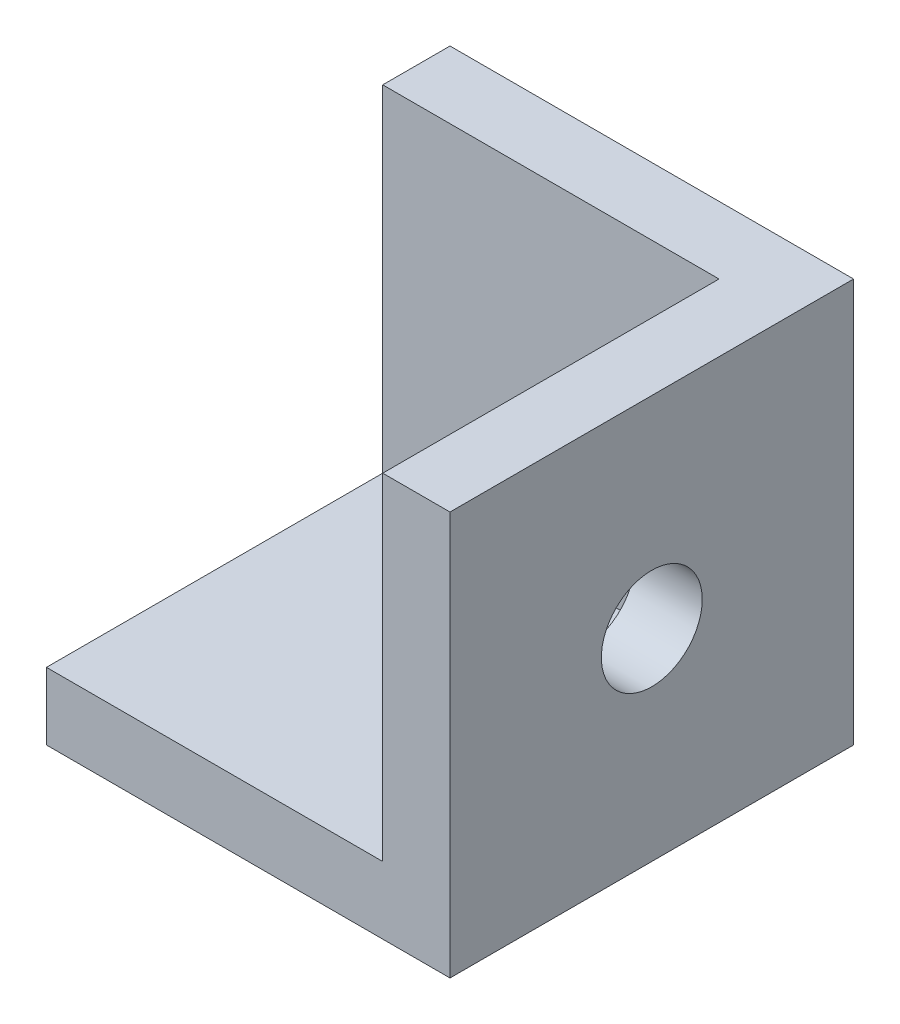
ISO-10303-21;
HEADER;
FILE_DESCRIPTION(('STEP AP214'),'2;1');
FILE_NAME('part.step','',(''),(''),'','','');
FILE_SCHEMA(('AUTOMOTIVE_DESIGN { 1 0 10303 214 1 1 1 1 }'));
ENDSEC;
DATA;
#1=APPLICATION_CONTEXT('core data for automotive mechanical design processes');
#2=APPLICATION_PROTOCOL_DEFINITION('international standard','automotive_design',2000,#1);
#3=PRODUCT_CONTEXT('',#1,'mechanical');
#4=PRODUCT('Part','Part','',(#3));
#5=PRODUCT_RELATED_PRODUCT_CATEGORY('part','',(#4));
#6=PRODUCT_DEFINITION_FORMATION('','',#4);
#7=PRODUCT_DEFINITION_CONTEXT('part definition',#1,'design');
#8=PRODUCT_DEFINITION('design','',#6,#7);
#9=PRODUCT_DEFINITION_SHAPE('','',#8);
#10=(LENGTH_UNIT() NAMED_UNIT(*) SI_UNIT(.MILLI.,.METRE.));
#11=(NAMED_UNIT(*) PLANE_ANGLE_UNIT() SI_UNIT($,.RADIAN.));
#12=(NAMED_UNIT(*) SI_UNIT($,.STERADIAN.) SOLID_ANGLE_UNIT());
#13=UNCERTAINTY_MEASURE_WITH_UNIT(LENGTH_MEASURE(1.E-05),#10,'distance_accuracy_value','');
#14=(GEOMETRIC_REPRESENTATION_CONTEXT(3) GLOBAL_UNCERTAINTY_ASSIGNED_CONTEXT((#13)) GLOBAL_UNIT_ASSIGNED_CONTEXT((#10,
#11,#12)) REPRESENTATION_CONTEXT('',''));
#15=CARTESIAN_POINT('',(0.,0.,0.));
#16=DIRECTION('',(0.,0.,1.));
#17=DIRECTION('',(1.,0.,0.));
#18=AXIS2_PLACEMENT_3D('',#15,#16,#17);
#19=CARTESIAN_POINT('',(19.05,3.175,3.175));
#20=DIRECTION('',(0.,0.,-1.));
#21=DIRECTION('',(-1.,0.,0.));
#22=AXIS2_PLACEMENT_3D('',#19,#20,#21);
#23=PLANE('',#22);
#24=DIRECTION('',(0.,-1.,0.));
#25=VECTOR('',#24,1.);
#26=CARTESIAN_POINT('',(15.875,3.175,3.175));
#27=LINE('',#26,#25);
#28=CARTESIAN_POINT('',(15.875,19.05,3.175));
#29=VERTEX_POINT('',#28);
#30=CARTESIAN_POINT('',(15.875,3.175,3.175));
#31=VERTEX_POINT('',#30);
#32=EDGE_CURVE('E127',#29,#31,#27,.T.);
#33=ORIENTED_EDGE('',*,*,#32,.F.);
#34=DIRECTION('',(-1.,0.,0.));
#35=VECTOR('',#34,1.);
#36=CARTESIAN_POINT('',(19.05,19.05,3.175));
#37=LINE('',#36,#35);
#38=CARTESIAN_POINT('',(0.,19.05,3.175));
#39=VERTEX_POINT('',#38);
#40=EDGE_CURVE('E112',#29,#39,#37,.T.);
#41=ORIENTED_EDGE('',*,*,#40,.T.);
#42=DIRECTION('',(0.,-1.,0.));
#43=VECTOR('',#42,1.);
#44=CARTESIAN_POINT('',(0.,3.175,3.175));
#45=LINE('',#44,#43);
#46=CARTESIAN_POINT('',(0.,3.175,3.175));
#47=VERTEX_POINT('',#46);
#48=EDGE_CURVE('E143',#39,#47,#45,.T.);
#49=ORIENTED_EDGE('',*,*,#48,.T.);
#50=DIRECTION('',(-1.,0.,0.));
#51=VECTOR('',#50,1.);
#52=CARTESIAN_POINT('',(19.05,3.175,3.175));
#53=LINE('',#52,#51);
#54=EDGE_CURVE('E151',#31,#47,#53,.T.);
#55=ORIENTED_EDGE('',*,*,#54,.F.);
#56=EDGE_LOOP('',(#33,#41,#49,#55));
#57=FACE_BOUND('',#56,.T.);
#58=ADVANCED_FACE('F37',(#57),#23,.F.);
#59=CARTESIAN_POINT('',(19.05,3.175,3.175));
#60=DIRECTION('',(0.,-1.,0.));
#61=DIRECTION('',(0.,0.,-1.));
#62=AXIS2_PLACEMENT_3D('',#59,#60,#61);
#63=PLANE('',#62);
#64=DIRECTION('',(0.,0.,1.));
#65=VECTOR('',#64,1.);
#66=CARTESIAN_POINT('',(15.875,3.175,3.175));
#67=LINE('',#66,#65);
#68=CARTESIAN_POINT('',(15.875,3.175,19.05));
#69=VERTEX_POINT('',#68);
#70=EDGE_CURVE('E119',#31,#69,#67,.T.);
#71=ORIENTED_EDGE('',*,*,#70,.F.);
#72=ORIENTED_EDGE('',*,*,#54,.T.);
#73=DIRECTION('',(0.,0.,1.));
#74=VECTOR('',#73,1.);
#75=CARTESIAN_POINT('',(0.,3.175,3.175));
#76=LINE('',#75,#74);
#77=CARTESIAN_POINT('',(0.,3.175,19.05));
#78=VERTEX_POINT('',#77);
#79=EDGE_CURVE('E146',#47,#78,#76,.T.);
#80=ORIENTED_EDGE('',*,*,#79,.T.);
#81=DIRECTION('',(-1.,0.,0.));
#82=VECTOR('',#81,1.);
#83=CARTESIAN_POINT('',(19.05,3.175,19.05));
#84=LINE('',#83,#82);
#85=EDGE_CURVE('E79',#69,#78,#84,.T.);
#86=ORIENTED_EDGE('',*,*,#85,.F.);
#87=EDGE_LOOP('',(#71,#72,#80,#86));
#88=FACE_BOUND('',#87,.T.);
#89=ADVANCED_FACE('F167',(#88),#63,.F.);
#90=CARTESIAN_POINT('',(19.05,0.,0.));
#91=DIRECTION('',(0.,1.,0.));
#92=DIRECTION('',(0.,0.,1.));
#93=AXIS2_PLACEMENT_3D('',#90,#91,#92);
#94=PLANE('',#93);
#95=DIRECTION('',(-1.,0.,0.));
#96=VECTOR('',#95,1.);
#97=CARTESIAN_POINT('',(19.05,0.,19.05));
#98=LINE('',#97,#96);
#99=CARTESIAN_POINT('',(19.05,0.,19.05));
#100=VERTEX_POINT('',#99);
#101=CARTESIAN_POINT('',(0.,0.,19.05));
#102=VERTEX_POINT('',#101);
#103=EDGE_CURVE('E85',#100,#102,#98,.T.);
#104=ORIENTED_EDGE('',*,*,#103,.T.);
#105=DIRECTION('',(0.,0.,-1.));
#106=VECTOR('',#105,1.);
#107=CARTESIAN_POINT('',(0.,0.,0.));
#108=LINE('',#107,#106);
#109=CARTESIAN_POINT('',(0.,0.,0.));
#110=VERTEX_POINT('',#109);
#111=EDGE_CURVE('E129',#102,#110,#108,.T.);
#112=ORIENTED_EDGE('',*,*,#111,.T.);
#113=DIRECTION('',(-1.,0.,0.));
#114=VECTOR('',#113,1.);
#115=CARTESIAN_POINT('',(19.05,0.,0.));
#116=LINE('',#115,#114);
#117=CARTESIAN_POINT('',(19.05,0.,0.));
#118=VERTEX_POINT('',#117);
#119=EDGE_CURVE('E11',#118,#110,#116,.T.);
#120=ORIENTED_EDGE('',*,*,#119,.F.);
#121=DIRECTION('',(0.,0.,-1.));
#122=VECTOR('',#121,1.);
#123=CARTESIAN_POINT('',(19.05,0.,0.));
#124=LINE('',#123,#122);
#125=EDGE_CURVE('E130',#100,#118,#124,.T.);
#126=ORIENTED_EDGE('',*,*,#125,.F.);
#127=EDGE_LOOP('',(#104,#112,#120,#126));
#128=FACE_BOUND('',#127,.T.);
#129=ADVANCED_FACE('F39',(#128),#94,.F.);
#130=CARTESIAN_POINT('',(19.05,0.,0.));
#131=DIRECTION('',(0.,0.,1.));
#132=DIRECTION('',(1.,0.,0.));
#133=AXIS2_PLACEMENT_3D('',#130,#131,#132);
#134=PLANE('',#133);
#135=ORIENTED_EDGE('',*,*,#119,.T.);
#136=DIRECTION('',(0.,1.,0.));
#137=VECTOR('',#136,1.);
#138=CARTESIAN_POINT('',(0.,0.,0.));
#139=LINE('',#138,#137);
#140=CARTESIAN_POINT('',(0.,19.05,0.));
#141=VERTEX_POINT('',#140);
#142=EDGE_CURVE('E138',#110,#141,#139,.T.);
#143=ORIENTED_EDGE('',*,*,#142,.T.);
#144=DIRECTION('',(-1.,0.,0.));
#145=VECTOR('',#144,1.);
#146=CARTESIAN_POINT('',(19.05,19.05,0.));
#147=LINE('',#146,#145);
#148=CARTESIAN_POINT('',(19.05,19.05,0.));
#149=VERTEX_POINT('',#148);
#150=EDGE_CURVE('E47',#149,#141,#147,.T.);
#151=ORIENTED_EDGE('',*,*,#150,.F.);
#152=DIRECTION('',(0.,1.,0.));
#153=VECTOR('',#152,1.);
#154=CARTESIAN_POINT('',(19.05,0.,0.));
#155=LINE('',#154,#153);
#156=EDGE_CURVE('E89',#118,#149,#155,.T.);
#157=ORIENTED_EDGE('',*,*,#156,.F.);
#158=EDGE_LOOP('',(#135,#143,#151,#157));
#159=FACE_BOUND('',#158,.T.);
#160=ADVANCED_FACE('F157',(#159),#134,.F.);
#161=CARTESIAN_POINT('',(19.05,19.05,3.175));
#162=DIRECTION('',(0.,-1.,0.));
#163=DIRECTION('',(0.,0.,-1.));
#164=AXIS2_PLACEMENT_3D('',#161,#162,#163);
#165=PLANE('',#164);
#166=ORIENTED_EDGE('',*,*,#150,.T.);
#167=DIRECTION('',(0.,0.,1.));
#168=VECTOR('',#167,1.);
#169=CARTESIAN_POINT('',(0.,19.05,3.175));
#170=LINE('',#169,#168);
#171=EDGE_CURVE('E141',#141,#39,#170,.T.);
#172=ORIENTED_EDGE('',*,*,#171,.T.);
#173=ORIENTED_EDGE('',*,*,#40,.F.);
#174=DIRECTION('',(0.,0.,1.));
#175=VECTOR('',#174,1.);
#176=CARTESIAN_POINT('',(15.875,19.05,0.));
#177=LINE('',#176,#175);
#178=CARTESIAN_POINT('',(15.875,19.05,19.05));
#179=VERTEX_POINT('',#178);
#180=EDGE_CURVE('E106',#29,#179,#177,.T.);
#181=ORIENTED_EDGE('',*,*,#180,.T.);
#182=DIRECTION('',(1.,0.,0.));
#183=VECTOR('',#182,1.);
#184=CARTESIAN_POINT('',(15.875,19.05,19.05));
#185=LINE('',#184,#183);
#186=CARTESIAN_POINT('',(19.05,19.05,19.05));
#187=VERTEX_POINT('',#186);
#188=EDGE_CURVE('E110',#179,#187,#185,.T.);
#189=ORIENTED_EDGE('',*,*,#188,.T.);
#190=DIRECTION('',(0.,0.,1.));
#191=VECTOR('',#190,1.);
#192=CARTESIAN_POINT('',(19.05,19.05,3.175));
#193=LINE('',#192,#191);
#194=EDGE_CURVE('E134',#149,#187,#193,.T.);
#195=ORIENTED_EDGE('',*,*,#194,.F.);
#196=EDGE_LOOP('',(#166,#172,#173,#181,#189,#195));
#197=FACE_BOUND('',#196,.T.);
#198=ADVANCED_FACE('F108',(#197),#165,.F.);
#199=CARTESIAN_POINT('',(19.05,3.175,19.05));
#200=DIRECTION('',(0.,0.,-1.));
#201=DIRECTION('',(-1.,0.,0.));
#202=AXIS2_PLACEMENT_3D('',#199,#200,#201);
#203=PLANE('',#202);
#204=DIRECTION('',(0.,-1.,0.));
#205=VECTOR('',#204,1.);
#206=CARTESIAN_POINT('',(19.05,3.175,19.05));
#207=LINE('',#206,#205);
#208=EDGE_CURVE('E55',#187,#100,#207,.T.);
#209=ORIENTED_EDGE('',*,*,#208,.F.);
#210=ORIENTED_EDGE('',*,*,#188,.F.);
#211=DIRECTION('',(0.,-1.,0.));
#212=VECTOR('',#211,1.);
#213=CARTESIAN_POINT('',(15.875,0.,19.05));
#214=LINE('',#213,#212);
#215=EDGE_CURVE('E116',#179,#69,#214,.T.);
#216=ORIENTED_EDGE('',*,*,#215,.T.);
#217=ORIENTED_EDGE('',*,*,#85,.T.);
#218=DIRECTION('',(0.,-1.,0.));
#219=VECTOR('',#218,1.);
#220=CARTESIAN_POINT('',(0.,3.175,19.05));
#221=LINE('',#220,#219);
#222=EDGE_CURVE('E132',#78,#102,#221,.T.);
#223=ORIENTED_EDGE('',*,*,#222,.T.);
#224=ORIENTED_EDGE('',*,*,#103,.F.);
#225=EDGE_LOOP('',(#209,#210,#216,#217,#223,#224));
#226=FACE_BOUND('',#225,.T.);
#227=ADVANCED_FACE('F118',(#226),#203,.F.);
#228=CARTESIAN_POINT('',(19.05,0.,0.));
#229=DIRECTION('',(1.,0.,0.));
#230=DIRECTION('',(0.,0.,-1.));
#231=AXIS2_PLACEMENT_3D('',#228,#229,#230);
#232=PLANE('',#231);
#233=CARTESIAN_POINT('',(19.05,9.525,9.525));
#234=DIRECTION('',(1.,0.,0.));
#235=DIRECTION('',(0.,0.,-1.));
#236=AXIS2_PLACEMENT_3D('',#233,#234,#235);
#237=CIRCLE('',#236,2.38125);
#238=CARTESIAN_POINT('',(19.05,9.525,7.14375));
#239=VERTEX_POINT('',#238);
#240=EDGE_CURVE('E283',#239,#239,#237,.T.);
#241=ORIENTED_EDGE('',*,*,#240,.F.);
#242=EDGE_LOOP('',(#241));
#243=FACE_BOUND('',#242,.T.);
#244=ORIENTED_EDGE('',*,*,#125,.T.);
#245=ORIENTED_EDGE('',*,*,#156,.T.);
#246=ORIENTED_EDGE('',*,*,#194,.T.);
#247=ORIENTED_EDGE('',*,*,#208,.T.);
#248=EDGE_LOOP('',(#244,#245,#246,#247));
#249=FACE_BOUND('',#248,.T.);
#250=ADVANCED_FACE('F168',(#243,#249),#232,.T.);
#251=CARTESIAN_POINT('',(0.,0.,0.));
#252=DIRECTION('',(1.,0.,0.));
#253=DIRECTION('',(0.,0.,-1.));
#254=AXIS2_PLACEMENT_3D('',#251,#252,#253);
#255=PLANE('',#254);
#256=ORIENTED_EDGE('',*,*,#111,.F.);
#257=ORIENTED_EDGE('',*,*,#222,.F.);
#258=ORIENTED_EDGE('',*,*,#79,.F.);
#259=ORIENTED_EDGE('',*,*,#48,.F.);
#260=ORIENTED_EDGE('',*,*,#171,.F.);
#261=ORIENTED_EDGE('',*,*,#142,.F.);
#262=EDGE_LOOP('',(#256,#257,#258,#259,#260,#261));
#263=FACE_BOUND('',#262,.T.);
#264=ADVANCED_FACE('F161',(#263),#255,.F.);
#265=CARTESIAN_POINT('',(15.875,0.,0.));
#266=DIRECTION('',(1.,0.,0.));
#267=DIRECTION('',(0.,0.,-1.));
#268=AXIS2_PLACEMENT_3D('',#265,#266,#267);
#269=PLANE('',#268);
#270=CARTESIAN_POINT('',(15.875,9.525,9.525));
#271=DIRECTION('',(1.,0.,0.));
#272=DIRECTION('',(0.,0.,-1.));
#273=AXIS2_PLACEMENT_3D('',#270,#271,#272);
#274=CIRCLE('',#273,2.38125);
#275=CARTESIAN_POINT('',(15.875,9.525,7.14375));
#276=VERTEX_POINT('',#275);
#277=EDGE_CURVE('E41',#276,#276,#274,.T.);
#278=ORIENTED_EDGE('',*,*,#277,.T.);
#279=EDGE_LOOP('',(#278));
#280=FACE_BOUND('',#279,.T.);
#281=ORIENTED_EDGE('',*,*,#180,.F.);
#282=ORIENTED_EDGE('',*,*,#32,.T.);
#283=ORIENTED_EDGE('',*,*,#70,.T.);
#284=ORIENTED_EDGE('',*,*,#215,.F.);
#285=EDGE_LOOP('',(#281,#282,#283,#284));
#286=FACE_BOUND('',#285,.T.);
#287=ADVANCED_FACE('F121',(#280,#286),#269,.F.);
#288=CARTESIAN_POINT('',(0.,9.525,9.525));
#289=DIRECTION('',(1.,0.,0.));
#290=DIRECTION('',(0.,0.,-1.));
#291=AXIS2_PLACEMENT_3D('',#288,#289,#290);
#292=CYLINDRICAL_SURFACE('',#291,2.38125);
#293=CARTESIAN_POINT('',(19.05,9.525,7.14375));
#294=CARTESIAN_POINT('',(19.0169270833333,9.525,7.14375));
#295=CARTESIAN_POINT('',(18.9838541666667,9.525,7.14375));
#296=CARTESIAN_POINT('',(18.9177083333333,9.525,7.14375));
#297=CARTESIAN_POINT('',(18.8846354166667,9.525,7.14375));
#298=CARTESIAN_POINT('',(18.8184895833333,9.525,7.14375));
#299=CARTESIAN_POINT('',(18.7854166666667,9.525,7.14375));
#300=CARTESIAN_POINT('',(18.7192708333333,9.525,7.14375));
#301=CARTESIAN_POINT('',(18.6861979166667,9.525,7.14375));
#302=CARTESIAN_POINT('',(18.6200520833333,9.525,7.14375));
#303=CARTESIAN_POINT('',(18.5869791666667,9.525,7.14375));
#304=CARTESIAN_POINT('',(18.5208333333333,9.525,7.14375));
#305=CARTESIAN_POINT('',(18.4877604166667,9.525,7.14375));
#306=CARTESIAN_POINT('',(18.4216145833333,9.525,7.14375));
#307=CARTESIAN_POINT('',(18.3885416666667,9.525,7.14375));
#308=CARTESIAN_POINT('',(18.3223958333333,9.525,7.14375));
#309=CARTESIAN_POINT('',(18.2893229166667,9.525,7.14375));
#310=CARTESIAN_POINT('',(18.2231770833333,9.525,7.14375));
#311=CARTESIAN_POINT('',(18.1901041666667,9.525,7.14375));
#312=CARTESIAN_POINT('',(18.1239583333333,9.525,7.14375));
#313=CARTESIAN_POINT('',(18.0908854166667,9.525,7.14375));
#314=CARTESIAN_POINT('',(18.0247395833333,9.525,7.14375));
#315=CARTESIAN_POINT('',(17.9916666666667,9.525,7.14375));
#316=CARTESIAN_POINT('',(17.9255208333333,9.525,7.14375));
#317=CARTESIAN_POINT('',(17.8924479166667,9.525,7.14375));
#318=CARTESIAN_POINT('',(17.8263020833333,9.525,7.14375));
#319=CARTESIAN_POINT('',(17.7932291666667,9.525,7.14375));
#320=CARTESIAN_POINT('',(17.7270833333333,9.525,7.14375));
#321=CARTESIAN_POINT('',(17.6940104166667,9.525,7.14375));
#322=CARTESIAN_POINT('',(17.6278645833333,9.525,7.14375));
#323=CARTESIAN_POINT('',(17.5947916666667,9.525,7.14375));
#324=CARTESIAN_POINT('',(17.5286458333333,9.525,7.14375));
#325=CARTESIAN_POINT('',(17.4955729166667,9.525,7.14375));
#326=CARTESIAN_POINT('',(17.4294270833333,9.525,7.14375));
#327=CARTESIAN_POINT('',(17.3963541666667,9.525,7.14375));
#328=CARTESIAN_POINT('',(17.3302083333333,9.525,7.14375));
#329=CARTESIAN_POINT('',(17.2971354166667,9.525,7.14375));
#330=CARTESIAN_POINT('',(17.2309895833333,9.525,7.14375));
#331=CARTESIAN_POINT('',(17.1979166666667,9.525,7.14375));
#332=CARTESIAN_POINT('',(17.1317708333333,9.525,7.14375));
#333=CARTESIAN_POINT('',(17.0986979166667,9.525,7.14375));
#334=CARTESIAN_POINT('',(17.0325520833333,9.525,7.14375));
#335=CARTESIAN_POINT('',(16.9994791666667,9.525,7.14375));
#336=CARTESIAN_POINT('',(16.9333333333333,9.525,7.14375));
#337=CARTESIAN_POINT('',(16.9002604166667,9.525,7.14375));
#338=CARTESIAN_POINT('',(16.8341145833333,9.525,7.14375));
#339=CARTESIAN_POINT('',(16.8010416666667,9.525,7.14375));
#340=CARTESIAN_POINT('',(16.7348958333333,9.525,7.14375));
#341=CARTESIAN_POINT('',(16.7018229166667,9.525,7.14375));
#342=CARTESIAN_POINT('',(16.6356770833333,9.525,7.14375));
#343=CARTESIAN_POINT('',(16.6026041666667,9.525,7.14375));
#344=CARTESIAN_POINT('',(16.5364583333333,9.525,7.14375));
#345=CARTESIAN_POINT('',(16.5033854166667,9.525,7.14375));
#346=CARTESIAN_POINT('',(16.4372395833333,9.525,7.14375));
#347=CARTESIAN_POINT('',(16.4041666666667,9.525,7.14375));
#348=CARTESIAN_POINT('',(16.3380208333333,9.525,7.14375));
#349=CARTESIAN_POINT('',(16.3049479166667,9.525,7.14375));
#350=CARTESIAN_POINT('',(16.2388020833333,9.525,7.14375));
#351=CARTESIAN_POINT('',(16.2057291666667,9.525,7.14375));
#352=CARTESIAN_POINT('',(16.1395833333333,9.525,7.14375));
#353=CARTESIAN_POINT('',(16.1065104166667,9.525,7.14375));
#354=CARTESIAN_POINT('',(16.0403645833333,9.525,7.14375));
#355=CARTESIAN_POINT('',(16.0072916666667,9.525,7.14375));
#356=CARTESIAN_POINT('',(15.9411458333333,9.525,7.14375));
#357=CARTESIAN_POINT('',(15.9080729166667,9.525,7.14375));
#358=CARTESIAN_POINT('',(15.875,9.525,7.14375));
#359=B_SPLINE_CURVE_WITH_KNOTS('',3,(#293,#294,#295,#296,#297,#298,#299,#300,#301,#302,#303,
#304,#305,#306,#307,#308,#309,#310,#311,#312,#313,#314,#315,#316,#317,#318,#319,#320,#321,#322,
#323,#324,#325,#326,#327,#328,#329,#330,#331,#332,#333,#334,#335,#336,#337,#338,#339,#340,#341,
#342,#343,#344,#345,#346,#347,#348,#349,#350,#351,#352,#353,#354,#355,#356,#357,#358),
.UNSPECIFIED.,.F.,.F.,(4,2,2,2,2,2,2,2,2,2,2,2,2,2,2,2,2,2,2,2,2,2,2,2,2,2,2,2,2,2,2,2,4),(0.,
0.0992187500000012,0.198437499999999,0.29765625,0.396875000000001,0.496093749999999,0.5953125,
0.694531250000002,0.793750000000003,0.892968750000001,0.992187500000002,1.09140625,1.190625,
1.28984375,1.3890625,1.48828125,1.5875,1.68671875,1.7859375,1.88515625,1.984375,2.08359375,
2.1828125,2.28203125,2.38125,2.48046875,2.5796875,2.67890625,2.778125,2.87734375,
2.97656250000001,3.07578125,3.175),.UNSPECIFIED.);
#360=EDGE_CURVE('BSEAM219',#239,#276,#359,.T.);
#361=ORIENTED_EDGE('',*,*,#240,.T.);
#362=ORIENTED_EDGE('',*,*,#277,.F.);
#363=ORIENTED_EDGE('',*,*,#360,.T.);
#364=ORIENTED_EDGE('',*,*,#360,.F.);
#365=EDGE_LOOP('',(#361,#363,#362,#364));
#366=FACE_BOUND('',#365,.T.);
#367=ADVANCED_FACE('F219',(#366),#292,.F.);
#368=CLOSED_SHELL('',(#58,#89,#129,#160,#198,#227,#250,#264,#287,#367));
#369=MANIFOLD_SOLID_BREP('B2',#368);
#370=ADVANCED_BREP_SHAPE_REPRESENTATION('',(#18,#369),#14);
#371=SHAPE_DEFINITION_REPRESENTATION(#9,#370);
ENDSEC;
END-ISO-10303-21;
